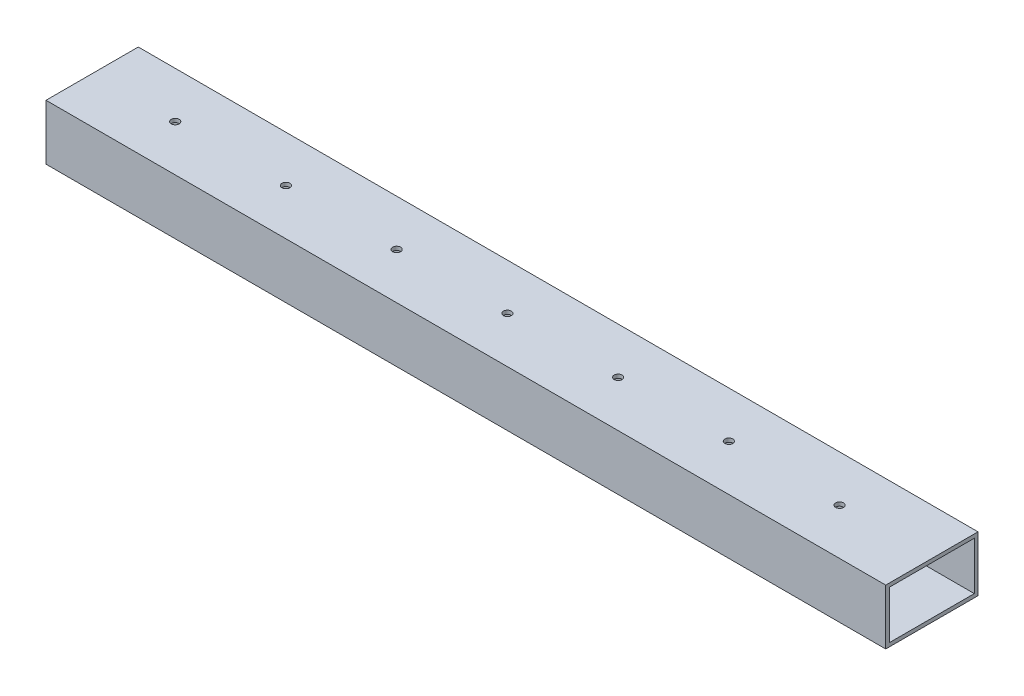
ISO-10303-21;
HEADER;
FILE_DESCRIPTION(('STEP AP214'),'2;1');
FILE_NAME('part.step','',(''),(''),'','','');
FILE_SCHEMA(('AUTOMOTIVE_DESIGN { 1 0 10303 214 1 1 1 1 }'));
ENDSEC;
DATA;
#1=APPLICATION_CONTEXT('core data for automotive mechanical design processes');
#2=APPLICATION_PROTOCOL_DEFINITION('international standard','automotive_design',2000,#1);
#3=PRODUCT_CONTEXT('',#1,'mechanical');
#4=PRODUCT('Part','Part','',(#3));
#5=PRODUCT_RELATED_PRODUCT_CATEGORY('part','',(#4));
#6=PRODUCT_DEFINITION_FORMATION('','',#4);
#7=PRODUCT_DEFINITION_CONTEXT('part definition',#1,'design');
#8=PRODUCT_DEFINITION('design','',#6,#7);
#9=PRODUCT_DEFINITION_SHAPE('','',#8);
#10=(LENGTH_UNIT() NAMED_UNIT(*) SI_UNIT(.MILLI.,.METRE.));
#11=(NAMED_UNIT(*) PLANE_ANGLE_UNIT() SI_UNIT($,.RADIAN.));
#12=(NAMED_UNIT(*) SI_UNIT($,.STERADIAN.) SOLID_ANGLE_UNIT());
#13=UNCERTAINTY_MEASURE_WITH_UNIT(LENGTH_MEASURE(1.E-05),#10,'distance_accuracy_value','');
#14=(GEOMETRIC_REPRESENTATION_CONTEXT(3) GLOBAL_UNCERTAINTY_ASSIGNED_CONTEXT((#13)) GLOBAL_UNIT_ASSIGNED_CONTEXT((#10,
#11,#12)) REPRESENTATION_CONTEXT('',''));
#15=CARTESIAN_POINT('',(0.,0.,0.));
#16=DIRECTION('',(0.,0.,1.));
#17=DIRECTION('',(1.,0.,0.));
#18=AXIS2_PLACEMENT_3D('',#15,#16,#17);
#19=CARTESIAN_POINT('',(181.507280679868,-229.299072168843,-866.486147986318));
#20=DIRECTION('',(0.,1.,0.));
#21=DIRECTION('',(0.,0.,1.));
#22=AXIS2_PLACEMENT_3D('',#19,#20,#21);
#23=CYLINDRICAL_SURFACE('',#22,4.3);
#24=CARTESIAN_POINT('',(181.507280679868,-169.299072168843,-866.486147986318));
#25=DIRECTION('',(0.,1.,0.));
#26=DIRECTION('',(0.,0.,1.));
#27=AXIS2_PLACEMENT_3D('',#24,#25,#26);
#28=CIRCLE('',#27,4.3);
#29=CARTESIAN_POINT('',(181.507280679868,-169.299072168843,-862.186147986318));
#30=VERTEX_POINT('',#29);
#31=EDGE_CURVE('E20',#30,#30,#28,.T.);
#32=ORIENTED_EDGE('',*,*,#31,.T.);
#33=EDGE_LOOP('',(#32));
#34=FACE_BOUND('',#33,.T.);
#35=CARTESIAN_POINT('',(181.507280679868,-173.299072168843,-866.486147986318));
#36=DIRECTION('',(0.,1.,0.));
#37=DIRECTION('',(0.,0.,1.));
#38=AXIS2_PLACEMENT_3D('',#35,#36,#37);
#39=CIRCLE('',#38,4.3);
#40=CARTESIAN_POINT('',(181.507280679868,-173.299072168843,-862.186147986318));
#41=VERTEX_POINT('',#40);
#42=EDGE_CURVE('E102',#41,#41,#39,.T.);
#43=ORIENTED_EDGE('',*,*,#42,.F.);
#44=EDGE_LOOP('',(#43));
#45=FACE_BOUND('',#44,.T.);
#46=ADVANCED_FACE('F17',(#34,#45),#23,.F.);
#47=CARTESIAN_POINT('',(61.5072806798675,-229.299072168843,-866.486147986318));
#48=DIRECTION('',(0.,1.,0.));
#49=DIRECTION('',(0.,0.,1.));
#50=AXIS2_PLACEMENT_3D('',#47,#48,#49);
#51=CYLINDRICAL_SURFACE('',#50,4.3);
#52=CARTESIAN_POINT('',(61.5072806798675,-173.299072168843,-866.486147986318));
#53=DIRECTION('',(0.,1.,0.));
#54=DIRECTION('',(0.,0.,1.));
#55=AXIS2_PLACEMENT_3D('',#52,#53,#54);
#56=CIRCLE('',#55,4.3);
#57=CARTESIAN_POINT('',(61.5072806798675,-173.299072168843,-862.186147986318));
#58=VERTEX_POINT('',#57);
#59=EDGE_CURVE('E209',#58,#58,#56,.T.);
#60=ORIENTED_EDGE('',*,*,#59,.F.);
#61=EDGE_LOOP('',(#60));
#62=FACE_BOUND('',#61,.T.);
#63=CARTESIAN_POINT('',(61.5072806798675,-169.299072168843,-866.486147986318));
#64=DIRECTION('',(0.,1.,0.));
#65=DIRECTION('',(0.,0.,1.));
#66=AXIS2_PLACEMENT_3D('',#63,#64,#65);
#67=CIRCLE('',#66,4.3);
#68=CARTESIAN_POINT('',(61.5072806798675,-169.299072168843,-862.186147986318));
#69=VERTEX_POINT('',#68);
#70=EDGE_CURVE('E234',#69,#69,#67,.T.);
#71=ORIENTED_EDGE('',*,*,#70,.T.);
#72=EDGE_LOOP('',(#71));
#73=FACE_BOUND('',#72,.T.);
#74=ADVANCED_FACE('F383',(#62,#73),#51,.F.);
#75=CARTESIAN_POINT('',(-58.4927193201326,-229.299072168843,-866.486147986318));
#76=DIRECTION('',(0.,1.,0.));
#77=DIRECTION('',(0.,0.,1.));
#78=AXIS2_PLACEMENT_3D('',#75,#76,#77);
#79=CYLINDRICAL_SURFACE('',#78,4.3);
#80=CARTESIAN_POINT('',(-58.4927193201326,-169.299072168843,-866.486147986318));
#81=DIRECTION('',(0.,1.,0.));
#82=DIRECTION('',(0.,0.,1.));
#83=AXIS2_PLACEMENT_3D('',#80,#81,#82);
#84=CIRCLE('',#83,4.3);
#85=CARTESIAN_POINT('',(-58.4927193201326,-169.299072168843,-862.186147986318));
#86=VERTEX_POINT('',#85);
#87=EDGE_CURVE('E231',#86,#86,#84,.T.);
#88=ORIENTED_EDGE('',*,*,#87,.T.);
#89=EDGE_LOOP('',(#88));
#90=FACE_BOUND('',#89,.T.);
#91=CARTESIAN_POINT('',(-58.4927193201326,-173.299072168843,-866.486147986318));
#92=DIRECTION('',(0.,1.,0.));
#93=DIRECTION('',(0.,0.,1.));
#94=AXIS2_PLACEMENT_3D('',#91,#92,#93);
#95=CIRCLE('',#94,4.3);
#96=CARTESIAN_POINT('',(-58.4927193201326,-173.299072168843,-862.186147986318));
#97=VERTEX_POINT('',#96);
#98=EDGE_CURVE('E205',#97,#97,#95,.T.);
#99=ORIENTED_EDGE('',*,*,#98,.F.);
#100=EDGE_LOOP('',(#99));
#101=FACE_BOUND('',#100,.T.);
#102=ADVANCED_FACE('F380',(#90,#101),#79,.F.);
#103=CARTESIAN_POINT('',(-178.492719320133,-229.299072168843,-866.486147986318));
#104=DIRECTION('',(0.,1.,0.));
#105=DIRECTION('',(0.,0.,1.));
#106=AXIS2_PLACEMENT_3D('',#103,#104,#105);
#107=CYLINDRICAL_SURFACE('',#106,4.3);
#108=CARTESIAN_POINT('',(-178.492719320133,-169.299072168843,-866.486147986318));
#109=DIRECTION('',(0.,1.,0.));
#110=DIRECTION('',(0.,0.,1.));
#111=AXIS2_PLACEMENT_3D('',#108,#109,#110);
#112=CIRCLE('',#111,4.3);
#113=CARTESIAN_POINT('',(-178.492719320133,-169.299072168843,-862.186147986318));
#114=VERTEX_POINT('',#113);
#115=EDGE_CURVE('E227',#114,#114,#112,.T.);
#116=ORIENTED_EDGE('',*,*,#115,.T.);
#117=EDGE_LOOP('',(#116));
#118=FACE_BOUND('',#117,.T.);
#119=CARTESIAN_POINT('',(-178.492719320133,-173.299072168843,-866.486147986318));
#120=DIRECTION('',(0.,1.,0.));
#121=DIRECTION('',(0.,0.,1.));
#122=AXIS2_PLACEMENT_3D('',#119,#120,#121);
#123=CIRCLE('',#122,4.3);
#124=CARTESIAN_POINT('',(-178.492719320133,-173.299072168843,-862.186147986318));
#125=VERTEX_POINT('',#124);
#126=EDGE_CURVE('E201',#125,#125,#123,.T.);
#127=ORIENTED_EDGE('',*,*,#126,.F.);
#128=EDGE_LOOP('',(#127));
#129=FACE_BOUND('',#128,.T.);
#130=ADVANCED_FACE('F376',(#118,#129),#107,.F.);
#131=CARTESIAN_POINT('',(-298.492719320131,-229.299072168843,-866.486147986318));
#132=DIRECTION('',(0.,1.,0.));
#133=DIRECTION('',(0.,0.,1.));
#134=AXIS2_PLACEMENT_3D('',#131,#132,#133);
#135=CYLINDRICAL_SURFACE('',#134,4.3);
#136=CARTESIAN_POINT('',(-298.492719320131,-169.299072168843,-866.486147986318));
#137=DIRECTION('',(0.,1.,0.));
#138=DIRECTION('',(0.,0.,1.));
#139=AXIS2_PLACEMENT_3D('',#136,#137,#138);
#140=CIRCLE('',#139,4.3);
#141=CARTESIAN_POINT('',(-298.492719320131,-169.299072168843,-862.186147986318));
#142=VERTEX_POINT('',#141);
#143=EDGE_CURVE('E223',#142,#142,#140,.T.);
#144=ORIENTED_EDGE('',*,*,#143,.T.);
#145=EDGE_LOOP('',(#144));
#146=FACE_BOUND('',#145,.T.);
#147=CARTESIAN_POINT('',(-298.492719320131,-173.299072168843,-866.486147986318));
#148=DIRECTION('',(0.,1.,0.));
#149=DIRECTION('',(0.,0.,1.));
#150=AXIS2_PLACEMENT_3D('',#147,#148,#149);
#151=CIRCLE('',#150,4.3);
#152=CARTESIAN_POINT('',(-298.492719320131,-173.299072168843,-862.186147986318));
#153=VERTEX_POINT('',#152);
#154=EDGE_CURVE('E197',#153,#153,#151,.T.);
#155=ORIENTED_EDGE('',*,*,#154,.F.);
#156=EDGE_LOOP('',(#155));
#157=FACE_BOUND('',#156,.T.);
#158=ADVANCED_FACE('F372',(#146,#157),#135,.F.);
#159=CARTESIAN_POINT('',(-418.492719320131,-229.299072168843,-866.486147986318));
#160=DIRECTION('',(0.,1.,0.));
#161=DIRECTION('',(0.,0.,1.));
#162=AXIS2_PLACEMENT_3D('',#159,#160,#161);
#163=CYLINDRICAL_SURFACE('',#162,4.3);
#164=CARTESIAN_POINT('',(-418.492719320131,-173.299072168843,-866.486147986318));
#165=DIRECTION('',(0.,1.,0.));
#166=DIRECTION('',(0.,0.,1.));
#167=AXIS2_PLACEMENT_3D('',#164,#165,#166);
#168=CIRCLE('',#167,4.3);
#169=CARTESIAN_POINT('',(-418.492719320131,-173.299072168843,-862.186147986318));
#170=VERTEX_POINT('',#169);
#171=EDGE_CURVE('E193',#170,#170,#168,.T.);
#172=ORIENTED_EDGE('',*,*,#171,.F.);
#173=EDGE_LOOP('',(#172));
#174=FACE_BOUND('',#173,.T.);
#175=CARTESIAN_POINT('',(-418.492719320131,-169.299072168843,-866.486147986318));
#176=DIRECTION('',(0.,1.,0.));
#177=DIRECTION('',(0.,0.,1.));
#178=AXIS2_PLACEMENT_3D('',#175,#176,#177);
#179=CIRCLE('',#178,4.3);
#180=CARTESIAN_POINT('',(-418.492719320131,-169.299072168843,-862.186147986318));
#181=VERTEX_POINT('',#180);
#182=EDGE_CURVE('E219',#181,#181,#179,.T.);
#183=ORIENTED_EDGE('',*,*,#182,.T.);
#184=EDGE_LOOP('',(#183));
#185=FACE_BOUND('',#184,.T.);
#186=ADVANCED_FACE('F368',(#174,#185),#163,.F.);
#187=CARTESIAN_POINT('',(-538.492719320132,-229.299072168843,-866.486147986318));
#188=DIRECTION('',(0.,1.,0.));
#189=DIRECTION('',(0.,0.,1.));
#190=AXIS2_PLACEMENT_3D('',#187,#188,#189);
#191=CYLINDRICAL_SURFACE('',#190,4.3);
#192=CARTESIAN_POINT('',(-538.492719320132,-169.299072168843,-866.486147986318));
#193=DIRECTION('',(0.,1.,0.));
#194=DIRECTION('',(0.,0.,1.));
#195=AXIS2_PLACEMENT_3D('',#192,#193,#194);
#196=CIRCLE('',#195,4.3);
#197=CARTESIAN_POINT('',(-538.492719320132,-169.299072168843,-862.186147986318));
#198=VERTEX_POINT('',#197);
#199=EDGE_CURVE('E103',#198,#198,#196,.T.);
#200=ORIENTED_EDGE('',*,*,#199,.T.);
#201=EDGE_LOOP('',(#200));
#202=FACE_BOUND('',#201,.T.);
#203=CARTESIAN_POINT('',(-538.492719320132,-173.299072168843,-866.486147986318));
#204=DIRECTION('',(0.,1.,0.));
#205=DIRECTION('',(0.,0.,1.));
#206=AXIS2_PLACEMENT_3D('',#203,#204,#205);
#207=CIRCLE('',#206,4.3);
#208=CARTESIAN_POINT('',(-538.492719320132,-173.299072168843,-862.186147986318));
#209=VERTEX_POINT('',#208);
#210=EDGE_CURVE('E134',#209,#209,#207,.T.);
#211=ORIENTED_EDGE('',*,*,#210,.F.);
#212=EDGE_LOOP('',(#211));
#213=FACE_BOUND('',#212,.T.);
#214=ADVANCED_FACE('F247',(#202,#213),#191,.F.);
#215=CARTESIAN_POINT('',(-129.876091028777,-169.299072168843,-866.486147986318));
#216=DIRECTION('',(0.,-1.,0.));
#217=DIRECTION('',(0.,0.,-1.));
#218=AXIS2_PLACEMENT_3D('',#215,#216,#217);
#219=PLANE('',#218);
#220=ORIENTED_EDGE('',*,*,#199,.F.);
#221=EDGE_LOOP('',(#220));
#222=FACE_BOUND('',#221,.T.);
#223=ORIENTED_EDGE('',*,*,#182,.F.);
#224=EDGE_LOOP('',(#223));
#225=FACE_BOUND('',#224,.T.);
#226=ORIENTED_EDGE('',*,*,#143,.F.);
#227=EDGE_LOOP('',(#226));
#228=FACE_BOUND('',#227,.T.);
#229=ORIENTED_EDGE('',*,*,#115,.F.);
#230=EDGE_LOOP('',(#229));
#231=FACE_BOUND('',#230,.T.);
#232=ORIENTED_EDGE('',*,*,#87,.F.);
#233=EDGE_LOOP('',(#232));
#234=FACE_BOUND('',#233,.T.);
#235=ORIENTED_EDGE('',*,*,#70,.F.);
#236=EDGE_LOOP('',(#235));
#237=FACE_BOUND('',#236,.T.);
#238=ORIENTED_EDGE('',*,*,#31,.F.);
#239=EDGE_LOOP('',(#238));
#240=FACE_BOUND('',#239,.T.);
#241=DIRECTION('',(-1.,0.,0.));
#242=VECTOR('',#241,1.);
#243=CARTESIAN_POINT('',(-129.876091028777,-169.299072168843,-816.486147986318));
#244=LINE('',#243,#242);
#245=CARTESIAN_POINT('',(-628.489347611488,-169.299072168843,-816.486147986318));
#246=VERTEX_POINT('',#245);
#247=CARTESIAN_POINT('',(281.510652388512,-169.299072168843,-816.486147986318));
#248=VERTEX_POINT('',#247);
#249=EDGE_CURVE('E123',#246,#248,#244,.F.);
#250=ORIENTED_EDGE('',*,*,#249,.T.);
#251=DIRECTION('',(0.,0.,-1.));
#252=VECTOR('',#251,1.);
#253=CARTESIAN_POINT('',(281.510652388512,-169.299072168843,-861.467295972638));
#254=LINE('',#253,#252);
#255=CARTESIAN_POINT('',(281.510652388512,-169.299072168843,-916.486147986319));
#256=VERTEX_POINT('',#255);
#257=EDGE_CURVE('E91',#256,#248,#254,.F.);
#258=ORIENTED_EDGE('',*,*,#257,.F.);
#259=DIRECTION('',(-1.,0.,0.));
#260=VECTOR('',#259,1.);
#261=CARTESIAN_POINT('',(-129.876091028777,-169.299072168843,-916.486147986319));
#262=LINE('',#261,#260);
#263=CARTESIAN_POINT('',(-628.489347611488,-169.299072168843,-916.486147986319));
#264=VERTEX_POINT('',#263);
#265=EDGE_CURVE('E294',#264,#256,#262,.F.);
#266=ORIENTED_EDGE('',*,*,#265,.F.);
#267=DIRECTION('',(0.,0.,-1.));
#268=VECTOR('',#267,1.);
#269=CARTESIAN_POINT('',(-628.489347611488,-169.299072168843,-861.467295972638));
#270=LINE('',#269,#268);
#271=EDGE_CURVE('E254',#264,#246,#270,.F.);
#272=ORIENTED_EDGE('',*,*,#271,.T.);
#273=EDGE_LOOP('',(#250,#258,#266,#272));
#274=FACE_BOUND('',#273,.T.);
#275=ADVANCED_FACE('F244',(#222,#225,#228,#231,#234,#237,#240,#274),#219,.F.);
#276=CARTESIAN_POINT('',(-129.876091028777,-199.299072168843,-820.486147986319));
#277=DIRECTION('',(0.,0.,-1.));
#278=DIRECTION('',(-1.,0.,0.));
#279=AXIS2_PLACEMENT_3D('',#276,#277,#278);
#280=PLANE('',#279);
#281=DIRECTION('',(0.,1.,0.));
#282=VECTOR('',#281,1.);
#283=CARTESIAN_POINT('',(281.510652388512,-246.310397048843,-820.486147986319));
#284=LINE('',#283,#282);
#285=CARTESIAN_POINT('',(281.510652388512,-225.299072168843,-820.486147986319));
#286=VERTEX_POINT('',#285);
#287=CARTESIAN_POINT('',(281.510652388512,-173.299072168843,-820.486147986319));
#288=VERTEX_POINT('',#287);
#289=EDGE_CURVE('E80',#286,#288,#284,.T.);
#290=ORIENTED_EDGE('',*,*,#289,.F.);
#291=DIRECTION('',(1.,0.,0.));
#292=VECTOR('',#291,1.);
#293=CARTESIAN_POINT('',(-129.876091028777,-225.299072168843,-820.486147986319));
#294=LINE('',#293,#292);
#295=CARTESIAN_POINT('',(-628.489347611488,-225.299072168843,-820.486147986319));
#296=VERTEX_POINT('',#295);
#297=EDGE_CURVE('E130',#296,#286,#294,.T.);
#298=ORIENTED_EDGE('',*,*,#297,.F.);
#299=DIRECTION('',(0.,1.,0.));
#300=VECTOR('',#299,1.);
#301=CARTESIAN_POINT('',(-628.489347611488,-246.310397048843,-820.486147986319));
#302=LINE('',#301,#300);
#303=CARTESIAN_POINT('',(-628.489347611488,-173.299072168843,-820.486147986319));
#304=VERTEX_POINT('',#303);
#305=EDGE_CURVE('E97',#296,#304,#302,.T.);
#306=ORIENTED_EDGE('',*,*,#305,.T.);
#307=DIRECTION('',(1.,0.,0.));
#308=VECTOR('',#307,1.);
#309=CARTESIAN_POINT('',(-129.876091028777,-173.299072168843,-820.486147986319));
#310=LINE('',#309,#308);
#311=EDGE_CURVE('E94',#288,#304,#310,.F.);
#312=ORIENTED_EDGE('',*,*,#311,.F.);
#313=EDGE_LOOP('',(#290,#298,#306,#312));
#314=FACE_BOUND('',#313,.T.);
#315=ADVANCED_FACE('F95',(#314),#280,.T.);
#316=CARTESIAN_POINT('',(-129.876091028777,-173.299072168843,-866.486147986318));
#317=DIRECTION('',(0.,-1.,0.));
#318=DIRECTION('',(0.,0.,-1.));
#319=AXIS2_PLACEMENT_3D('',#316,#317,#318);
#320=PLANE('',#319);
#321=ORIENTED_EDGE('',*,*,#210,.T.);
#322=EDGE_LOOP('',(#321));
#323=FACE_BOUND('',#322,.T.);
#324=ORIENTED_EDGE('',*,*,#171,.T.);
#325=EDGE_LOOP('',(#324));
#326=FACE_BOUND('',#325,.T.);
#327=ORIENTED_EDGE('',*,*,#154,.T.);
#328=EDGE_LOOP('',(#327));
#329=FACE_BOUND('',#328,.T.);
#330=ORIENTED_EDGE('',*,*,#126,.T.);
#331=EDGE_LOOP('',(#330));
#332=FACE_BOUND('',#331,.T.);
#333=ORIENTED_EDGE('',*,*,#98,.T.);
#334=EDGE_LOOP('',(#333));
#335=FACE_BOUND('',#334,.T.);
#336=ORIENTED_EDGE('',*,*,#59,.T.);
#337=EDGE_LOOP('',(#336));
#338=FACE_BOUND('',#337,.T.);
#339=ORIENTED_EDGE('',*,*,#42,.T.);
#340=EDGE_LOOP('',(#339));
#341=FACE_BOUND('',#340,.T.);
#342=DIRECTION('',(0.,0.,-1.));
#343=VECTOR('',#342,1.);
#344=CARTESIAN_POINT('',(281.510652388512,-173.299072168843,-861.467295972638));
#345=LINE('',#344,#343);
#346=CARTESIAN_POINT('',(281.510652388512,-173.299072168843,-912.48614798632));
#347=VERTEX_POINT('',#346);
#348=EDGE_CURVE('E85',#288,#347,#345,.T.);
#349=ORIENTED_EDGE('',*,*,#348,.F.);
#350=ORIENTED_EDGE('',*,*,#311,.T.);
#351=DIRECTION('',(0.,0.,-1.));
#352=VECTOR('',#351,1.);
#353=CARTESIAN_POINT('',(-628.489347611488,-173.299072168843,-861.467295972638));
#354=LINE('',#353,#352);
#355=CARTESIAN_POINT('',(-628.489347611488,-173.299072168843,-912.48614798632));
#356=VERTEX_POINT('',#355);
#357=EDGE_CURVE('E277',#304,#356,#354,.T.);
#358=ORIENTED_EDGE('',*,*,#357,.T.);
#359=DIRECTION('',(-1.,0.,0.));
#360=VECTOR('',#359,1.);
#361=CARTESIAN_POINT('',(-129.876091028777,-173.299072168843,-912.48614798632));
#362=LINE('',#361,#360);
#363=EDGE_CURVE('E106',#356,#347,#362,.F.);
#364=ORIENTED_EDGE('',*,*,#363,.T.);
#365=EDGE_LOOP('',(#349,#350,#358,#364));
#366=FACE_BOUND('',#365,.T.);
#367=ADVANCED_FACE('F105',(#323,#326,#329,#332,#335,#338,#341,#366),#320,.T.);
#368=CARTESIAN_POINT('',(-129.876091028777,-199.299072168843,-912.48614798632));
#369=DIRECTION('',(0.,0.,-1.));
#370=DIRECTION('',(-1.,0.,0.));
#371=AXIS2_PLACEMENT_3D('',#368,#369,#370);
#372=PLANE('',#371);
#373=DIRECTION('',(1.,0.,0.));
#374=VECTOR('',#373,1.);
#375=CARTESIAN_POINT('',(-129.876091028777,-225.299072168843,-912.48614798632));
#376=LINE('',#375,#374);
#377=CARTESIAN_POINT('',(281.510652388512,-225.299072168843,-912.48614798632));
#378=VERTEX_POINT('',#377);
#379=CARTESIAN_POINT('',(-628.489347611488,-225.299072168843,-912.48614798632));
#380=VERTEX_POINT('',#379);
#381=EDGE_CURVE('E127',#378,#380,#376,.F.);
#382=ORIENTED_EDGE('',*,*,#381,.F.);
#383=DIRECTION('',(0.,1.,0.));
#384=VECTOR('',#383,1.);
#385=CARTESIAN_POINT('',(281.510652388512,-246.310397048843,-912.48614798632));
#386=LINE('',#385,#384);
#387=EDGE_CURVE('E109',#347,#378,#386,.F.);
#388=ORIENTED_EDGE('',*,*,#387,.F.);
#389=ORIENTED_EDGE('',*,*,#363,.F.);
#390=DIRECTION('',(0.,1.,0.));
#391=VECTOR('',#390,1.);
#392=CARTESIAN_POINT('',(-628.489347611488,-246.310397048843,-912.48614798632));
#393=LINE('',#392,#391);
#394=EDGE_CURVE('E189',#356,#380,#393,.F.);
#395=ORIENTED_EDGE('',*,*,#394,.T.);
#396=EDGE_LOOP('',(#382,#388,#389,#395));
#397=FACE_BOUND('',#396,.T.);
#398=ADVANCED_FACE('F356',(#397),#372,.F.);
#399=CARTESIAN_POINT('',(-129.876091028777,-225.299072168843,-866.486147986318));
#400=DIRECTION('',(0.,1.,0.));
#401=DIRECTION('',(0.,0.,1.));
#402=AXIS2_PLACEMENT_3D('',#399,#400,#401);
#403=PLANE('',#402);
#404=CARTESIAN_POINT('',(-538.492719320132,-225.299072168843,-866.486147986318));
#405=DIRECTION('',(0.,1.,0.));
#406=DIRECTION('',(0.,0.,1.));
#407=AXIS2_PLACEMENT_3D('',#404,#405,#406);
#408=CIRCLE('',#407,4.3);
#409=CARTESIAN_POINT('',(-538.492719320132,-225.299072168843,-862.186147986318));
#410=VERTEX_POINT('',#409);
#411=EDGE_CURVE('E160',#410,#410,#408,.F.);
#412=ORIENTED_EDGE('',*,*,#411,.T.);
#413=EDGE_LOOP('',(#412));
#414=FACE_BOUND('',#413,.T.);
#415=CARTESIAN_POINT('',(-418.492719320131,-225.299072168843,-866.486147986318));
#416=DIRECTION('',(0.,1.,0.));
#417=DIRECTION('',(0.,0.,1.));
#418=AXIS2_PLACEMENT_3D('',#415,#416,#417);
#419=CIRCLE('',#418,4.3);
#420=CARTESIAN_POINT('',(-418.492719320131,-225.299072168843,-862.186147986318));
#421=VERTEX_POINT('',#420);
#422=EDGE_CURVE('E165',#421,#421,#419,.F.);
#423=ORIENTED_EDGE('',*,*,#422,.T.);
#424=EDGE_LOOP('',(#423));
#425=FACE_BOUND('',#424,.T.);
#426=CARTESIAN_POINT('',(-298.492719320131,-225.299072168843,-866.486147986318));
#427=DIRECTION('',(0.,1.,0.));
#428=DIRECTION('',(0.,0.,1.));
#429=AXIS2_PLACEMENT_3D('',#426,#427,#428);
#430=CIRCLE('',#429,4.3);
#431=CARTESIAN_POINT('',(-298.492719320131,-225.299072168843,-862.186147986318));
#432=VERTEX_POINT('',#431);
#433=EDGE_CURVE('E169',#432,#432,#430,.F.);
#434=ORIENTED_EDGE('',*,*,#433,.T.);
#435=EDGE_LOOP('',(#434));
#436=FACE_BOUND('',#435,.T.);
#437=CARTESIAN_POINT('',(-178.492719320133,-225.299072168843,-866.486147986318));
#438=DIRECTION('',(0.,1.,0.));
#439=DIRECTION('',(0.,0.,1.));
#440=AXIS2_PLACEMENT_3D('',#437,#438,#439);
#441=CIRCLE('',#440,4.3);
#442=CARTESIAN_POINT('',(-178.492719320133,-225.299072168843,-862.186147986318));
#443=VERTEX_POINT('',#442);
#444=EDGE_CURVE('E173',#443,#443,#441,.F.);
#445=ORIENTED_EDGE('',*,*,#444,.T.);
#446=EDGE_LOOP('',(#445));
#447=FACE_BOUND('',#446,.T.);
#448=CARTESIAN_POINT('',(-58.4927193201326,-225.299072168843,-866.486147986318));
#449=DIRECTION('',(0.,1.,0.));
#450=DIRECTION('',(0.,0.,1.));
#451=AXIS2_PLACEMENT_3D('',#448,#449,#450);
#452=CIRCLE('',#451,4.3);
#453=CARTESIAN_POINT('',(-58.4927193201326,-225.299072168843,-862.186147986318));
#454=VERTEX_POINT('',#453);
#455=EDGE_CURVE('E177',#454,#454,#452,.F.);
#456=ORIENTED_EDGE('',*,*,#455,.T.);
#457=EDGE_LOOP('',(#456));
#458=FACE_BOUND('',#457,.T.);
#459=CARTESIAN_POINT('',(61.5072806798675,-225.299072168843,-866.486147986318));
#460=DIRECTION('',(0.,1.,0.));
#461=DIRECTION('',(0.,0.,1.));
#462=AXIS2_PLACEMENT_3D('',#459,#460,#461);
#463=CIRCLE('',#462,4.3);
#464=CARTESIAN_POINT('',(61.5072806798675,-225.299072168843,-862.186147986318));
#465=VERTEX_POINT('',#464);
#466=EDGE_CURVE('E181',#465,#465,#463,.F.);
#467=ORIENTED_EDGE('',*,*,#466,.T.);
#468=EDGE_LOOP('',(#467));
#469=FACE_BOUND('',#468,.T.);
#470=CARTESIAN_POINT('',(181.507280679868,-225.299072168843,-866.486147986318));
#471=DIRECTION('',(0.,1.,0.));
#472=DIRECTION('',(0.,0.,1.));
#473=AXIS2_PLACEMENT_3D('',#470,#471,#472);
#474=CIRCLE('',#473,4.3);
#475=CARTESIAN_POINT('',(181.507280679868,-225.299072168843,-862.186147986318));
#476=VERTEX_POINT('',#475);
#477=EDGE_CURVE('E185',#476,#476,#474,.F.);
#478=ORIENTED_EDGE('',*,*,#477,.T.);
#479=EDGE_LOOP('',(#478));
#480=FACE_BOUND('',#479,.T.);
#481=DIRECTION('',(0.,0.,-1.));
#482=VECTOR('',#481,1.);
#483=CARTESIAN_POINT('',(281.510652388512,-225.299072168843,-861.467295972638));
#484=LINE('',#483,#482);
#485=EDGE_CURVE('E88',#378,#286,#484,.F.);
#486=ORIENTED_EDGE('',*,*,#485,.F.);
#487=ORIENTED_EDGE('',*,*,#381,.T.);
#488=DIRECTION('',(0.,0.,-1.));
#489=VECTOR('',#488,1.);
#490=CARTESIAN_POINT('',(-628.489347611488,-225.299072168843,-861.467295972638));
#491=LINE('',#490,#489);
#492=EDGE_CURVE('E282',#380,#296,#491,.F.);
#493=ORIENTED_EDGE('',*,*,#492,.T.);
#494=ORIENTED_EDGE('',*,*,#297,.T.);
#495=EDGE_LOOP('',(#486,#487,#493,#494));
#496=FACE_BOUND('',#495,.T.);
#497=ADVANCED_FACE('F353',(#414,#425,#436,#447,#458,#469,#480,#496),#403,.T.);
#498=CARTESIAN_POINT('',(-129.876091028777,-199.299072168843,-816.486147986318));
#499=DIRECTION('',(0.,0.,-1.));
#500=DIRECTION('',(-1.,0.,0.));
#501=AXIS2_PLACEMENT_3D('',#498,#499,#500);
#502=PLANE('',#501);
#503=DIRECTION('',(1.,0.,0.));
#504=VECTOR('',#503,1.);
#505=CARTESIAN_POINT('',(-129.876091028777,-229.299072168843,-816.486147986318));
#506=LINE('',#505,#504);
#507=CARTESIAN_POINT('',(-628.489347611488,-229.299072168843,-816.486147986318));
#508=VERTEX_POINT('',#507);
#509=CARTESIAN_POINT('',(281.510652388512,-229.299072168843,-816.486147986318));
#510=VERTEX_POINT('',#509);
#511=EDGE_CURVE('E164',#508,#510,#506,.T.);
#512=ORIENTED_EDGE('',*,*,#511,.T.);
#513=DIRECTION('',(0.,1.,0.));
#514=VECTOR('',#513,1.);
#515=CARTESIAN_POINT('',(281.510652388512,-246.310397048843,-816.486147986318));
#516=LINE('',#515,#514);
#517=EDGE_CURVE('E120',#248,#510,#516,.F.);
#518=ORIENTED_EDGE('',*,*,#517,.F.);
#519=ORIENTED_EDGE('',*,*,#249,.F.);
#520=DIRECTION('',(0.,1.,0.));
#521=VECTOR('',#520,1.);
#522=CARTESIAN_POINT('',(-628.489347611488,-246.310397048843,-816.486147986318));
#523=LINE('',#522,#521);
#524=EDGE_CURVE('E264',#246,#508,#523,.F.);
#525=ORIENTED_EDGE('',*,*,#524,.T.);
#526=EDGE_LOOP('',(#512,#518,#519,#525));
#527=FACE_BOUND('',#526,.T.);
#528=ADVANCED_FACE('F263',(#527),#502,.F.);
#529=CARTESIAN_POINT('',(281.510652388512,-246.310397048843,-861.467295972638));
#530=DIRECTION('',(1.,0.,0.));
#531=DIRECTION('',(0.,0.,-1.));
#532=AXIS2_PLACEMENT_3D('',#529,#530,#531);
#533=PLANE('',#532);
#534=ORIENTED_EDGE('',*,*,#387,.T.);
#535=ORIENTED_EDGE('',*,*,#485,.T.);
#536=ORIENTED_EDGE('',*,*,#289,.T.);
#537=ORIENTED_EDGE('',*,*,#348,.T.);
#538=EDGE_LOOP('',(#534,#535,#536,#537));
#539=FACE_BOUND('',#538,.T.);
#540=DIRECTION('',(0.,1.,0.));
#541=VECTOR('',#540,1.);
#542=CARTESIAN_POINT('',(281.510652388512,-199.299072168843,-916.486147986319));
#543=LINE('',#542,#541);
#544=CARTESIAN_POINT('',(281.510652388512,-229.299072168843,-916.486147986319));
#545=VERTEX_POINT('',#544);
#546=EDGE_CURVE('E261',#256,#545,#543,.F.);
#547=ORIENTED_EDGE('',*,*,#546,.F.);
#548=ORIENTED_EDGE('',*,*,#257,.T.);
#549=ORIENTED_EDGE('',*,*,#517,.T.);
#550=DIRECTION('',(0.,0.,1.));
#551=VECTOR('',#550,1.);
#552=CARTESIAN_POINT('',(281.510652388512,-229.299072168843,-866.486147986318));
#553=LINE('',#552,#551);
#554=EDGE_CURVE('E267',#510,#545,#553,.F.);
#555=ORIENTED_EDGE('',*,*,#554,.T.);
#556=EDGE_LOOP('',(#547,#548,#549,#555));
#557=FACE_BOUND('',#556,.T.);
#558=ADVANCED_FACE('F82',(#539,#557),#533,.T.);
#559=CARTESIAN_POINT('',(-129.876091028777,-199.299072168843,-916.486147986319));
#560=DIRECTION('',(0.,0.,-1.));
#561=DIRECTION('',(-1.,0.,0.));
#562=AXIS2_PLACEMENT_3D('',#559,#560,#561);
#563=PLANE('',#562);
#564=ORIENTED_EDGE('',*,*,#546,.T.);
#565=DIRECTION('',(1.,0.,0.));
#566=VECTOR('',#565,1.);
#567=CARTESIAN_POINT('',(-129.876091028777,-229.299072168843,-916.486147986319));
#568=LINE('',#567,#566);
#569=CARTESIAN_POINT('',(-628.489347611488,-229.299072168843,-916.486147986319));
#570=VERTEX_POINT('',#569);
#571=EDGE_CURVE('E270',#545,#570,#568,.F.);
#572=ORIENTED_EDGE('',*,*,#571,.T.);
#573=DIRECTION('',(0.,1.,0.));
#574=VECTOR('',#573,1.);
#575=CARTESIAN_POINT('',(-628.489347611488,-246.310397048843,-916.486147986319));
#576=LINE('',#575,#574);
#577=EDGE_CURVE('E36',#570,#264,#576,.T.);
#578=ORIENTED_EDGE('',*,*,#577,.T.);
#579=ORIENTED_EDGE('',*,*,#265,.T.);
#580=EDGE_LOOP('',(#564,#572,#578,#579));
#581=FACE_BOUND('',#580,.T.);
#582=ADVANCED_FACE('F345',(#581),#563,.T.);
#583=CARTESIAN_POINT('',(-628.489347611488,-246.310397048843,-861.467295972638));
#584=DIRECTION('',(1.,0.,0.));
#585=DIRECTION('',(0.,0.,-1.));
#586=AXIS2_PLACEMENT_3D('',#583,#584,#585);
#587=PLANE('',#586);
#588=ORIENTED_EDGE('',*,*,#357,.F.);
#589=ORIENTED_EDGE('',*,*,#305,.F.);
#590=ORIENTED_EDGE('',*,*,#492,.F.);
#591=ORIENTED_EDGE('',*,*,#394,.F.);
#592=EDGE_LOOP('',(#588,#589,#590,#591));
#593=FACE_BOUND('',#592,.T.);
#594=DIRECTION('',(0.,0.,1.));
#595=VECTOR('',#594,1.);
#596=CARTESIAN_POINT('',(-628.489347611488,-229.299072168843,-866.486147986318));
#597=LINE('',#596,#595);
#598=EDGE_CURVE('E159',#570,#508,#597,.T.);
#599=ORIENTED_EDGE('',*,*,#598,.T.);
#600=ORIENTED_EDGE('',*,*,#524,.F.);
#601=ORIENTED_EDGE('',*,*,#271,.F.);
#602=ORIENTED_EDGE('',*,*,#577,.F.);
#603=EDGE_LOOP('',(#599,#600,#601,#602));
#604=FACE_BOUND('',#603,.T.);
#605=ADVANCED_FACE('F305',(#593,#604),#587,.F.);
#606=CARTESIAN_POINT('',(181.507280679868,-229.299072168843,-866.486147986318));
#607=DIRECTION('',(0.,1.,0.));
#608=DIRECTION('',(0.,0.,1.));
#609=AXIS2_PLACEMENT_3D('',#606,#607,#608);
#610=CYLINDRICAL_SURFACE('',#609,4.3);
#611=ORIENTED_EDGE('',*,*,#477,.F.);
#612=EDGE_LOOP('',(#611));
#613=FACE_BOUND('',#612,.T.);
#614=CARTESIAN_POINT('',(181.507280679868,-229.299072168843,-866.486147986318));
#615=DIRECTION('',(0.,1.,0.));
#616=DIRECTION('',(0.,0.,1.));
#617=AXIS2_PLACEMENT_3D('',#614,#615,#616);
#618=CIRCLE('',#617,4.3);
#619=CARTESIAN_POINT('',(181.507280679868,-229.299072168843,-862.186147986318));
#620=VERTEX_POINT('',#619);
#621=EDGE_CURVE('E155',#620,#620,#618,.F.);
#622=ORIENTED_EDGE('',*,*,#621,.T.);
#623=EDGE_LOOP('',(#622));
#624=FACE_BOUND('',#623,.T.);
#625=ADVANCED_FACE('F338',(#613,#624),#610,.F.);
#626=CARTESIAN_POINT('',(61.5072806798675,-229.299072168843,-866.486147986318));
#627=DIRECTION('',(0.,1.,0.));
#628=DIRECTION('',(0.,0.,1.));
#629=AXIS2_PLACEMENT_3D('',#626,#627,#628);
#630=CYLINDRICAL_SURFACE('',#629,4.3);
#631=CARTESIAN_POINT('',(61.5072806798675,-229.299072168843,-866.486147986318));
#632=DIRECTION('',(0.,1.,0.));
#633=DIRECTION('',(0.,0.,1.));
#634=AXIS2_PLACEMENT_3D('',#631,#632,#633);
#635=CIRCLE('',#634,4.3);
#636=CARTESIAN_POINT('',(61.5072806798675,-229.299072168843,-862.186147986318));
#637=VERTEX_POINT('',#636);
#638=EDGE_CURVE('E151',#637,#637,#635,.F.);
#639=ORIENTED_EDGE('',*,*,#638,.T.);
#640=EDGE_LOOP('',(#639));
#641=FACE_BOUND('',#640,.T.);
#642=ORIENTED_EDGE('',*,*,#466,.F.);
#643=EDGE_LOOP('',(#642));
#644=FACE_BOUND('',#643,.T.);
#645=ADVANCED_FACE('F334',(#641,#644),#630,.F.);
#646=CARTESIAN_POINT('',(-58.4927193201326,-229.299072168843,-866.486147986318));
#647=DIRECTION('',(0.,1.,0.));
#648=DIRECTION('',(0.,0.,1.));
#649=AXIS2_PLACEMENT_3D('',#646,#647,#648);
#650=CYLINDRICAL_SURFACE('',#649,4.3);
#651=CARTESIAN_POINT('',(-58.4927193201326,-229.299072168843,-866.486147986318));
#652=DIRECTION('',(0.,1.,0.));
#653=DIRECTION('',(0.,0.,1.));
#654=AXIS2_PLACEMENT_3D('',#651,#652,#653);
#655=CIRCLE('',#654,4.3);
#656=CARTESIAN_POINT('',(-58.4927193201326,-229.299072168843,-862.186147986318));
#657=VERTEX_POINT('',#656);
#658=EDGE_CURVE('E147',#657,#657,#655,.F.);
#659=ORIENTED_EDGE('',*,*,#658,.T.);
#660=EDGE_LOOP('',(#659));
#661=FACE_BOUND('',#660,.T.);
#662=ORIENTED_EDGE('',*,*,#455,.F.);
#663=EDGE_LOOP('',(#662));
#664=FACE_BOUND('',#663,.T.);
#665=ADVANCED_FACE('F330',(#661,#664),#650,.F.);
#666=CARTESIAN_POINT('',(-178.492719320133,-229.299072168843,-866.486147986318));
#667=DIRECTION('',(0.,1.,0.));
#668=DIRECTION('',(0.,0.,1.));
#669=AXIS2_PLACEMENT_3D('',#666,#667,#668);
#670=CYLINDRICAL_SURFACE('',#669,4.3);
#671=ORIENTED_EDGE('',*,*,#444,.F.);
#672=EDGE_LOOP('',(#671));
#673=FACE_BOUND('',#672,.T.);
#674=CARTESIAN_POINT('',(-178.492719320133,-229.299072168843,-866.486147986318));
#675=DIRECTION('',(0.,1.,0.));
#676=DIRECTION('',(0.,0.,1.));
#677=AXIS2_PLACEMENT_3D('',#674,#675,#676);
#678=CIRCLE('',#677,4.3);
#679=CARTESIAN_POINT('',(-178.492719320133,-229.299072168843,-862.186147986318));
#680=VERTEX_POINT('',#679);
#681=EDGE_CURVE('E143',#680,#680,#678,.F.);
#682=ORIENTED_EDGE('',*,*,#681,.T.);
#683=EDGE_LOOP('',(#682));
#684=FACE_BOUND('',#683,.T.);
#685=ADVANCED_FACE('F326',(#673,#684),#670,.F.);
#686=CARTESIAN_POINT('',(-298.492719320131,-229.299072168843,-866.486147986318));
#687=DIRECTION('',(0.,1.,0.));
#688=DIRECTION('',(0.,0.,1.));
#689=AXIS2_PLACEMENT_3D('',#686,#687,#688);
#690=CYLINDRICAL_SURFACE('',#689,4.3);
#691=ORIENTED_EDGE('',*,*,#433,.F.);
#692=EDGE_LOOP('',(#691));
#693=FACE_BOUND('',#692,.T.);
#694=CARTESIAN_POINT('',(-298.492719320131,-229.299072168843,-866.486147986318));
#695=DIRECTION('',(0.,1.,0.));
#696=DIRECTION('',(0.,0.,1.));
#697=AXIS2_PLACEMENT_3D('',#694,#695,#696);
#698=CIRCLE('',#697,4.3);
#699=CARTESIAN_POINT('',(-298.492719320131,-229.299072168843,-862.186147986318));
#700=VERTEX_POINT('',#699);
#701=EDGE_CURVE('E139',#700,#700,#698,.F.);
#702=ORIENTED_EDGE('',*,*,#701,.T.);
#703=EDGE_LOOP('',(#702));
#704=FACE_BOUND('',#703,.T.);
#705=ADVANCED_FACE('F322',(#693,#704),#690,.F.);
#706=CARTESIAN_POINT('',(-418.492719320131,-229.299072168843,-866.486147986318));
#707=DIRECTION('',(0.,1.,0.));
#708=DIRECTION('',(0.,0.,1.));
#709=AXIS2_PLACEMENT_3D('',#706,#707,#708);
#710=CYLINDRICAL_SURFACE('',#709,4.3);
#711=ORIENTED_EDGE('',*,*,#422,.F.);
#712=EDGE_LOOP('',(#711));
#713=FACE_BOUND('',#712,.T.);
#714=CARTESIAN_POINT('',(-418.492719320131,-229.299072168843,-866.486147986318));
#715=DIRECTION('',(0.,1.,0.));
#716=DIRECTION('',(0.,0.,1.));
#717=AXIS2_PLACEMENT_3D('',#714,#715,#716);
#718=CIRCLE('',#717,4.3);
#719=CARTESIAN_POINT('',(-418.492719320131,-229.299072168843,-862.186147986318));
#720=VERTEX_POINT('',#719);
#721=EDGE_CURVE('E27',#720,#720,#718,.F.);
#722=ORIENTED_EDGE('',*,*,#721,.T.);
#723=EDGE_LOOP('',(#722));
#724=FACE_BOUND('',#723,.T.);
#725=ADVANCED_FACE('F314',(#713,#724),#710,.F.);
#726=CARTESIAN_POINT('',(-538.492719320132,-229.299072168843,-866.486147986318));
#727=DIRECTION('',(0.,1.,0.));
#728=DIRECTION('',(0.,0.,1.));
#729=AXIS2_PLACEMENT_3D('',#726,#727,#728);
#730=CYLINDRICAL_SURFACE('',#729,4.3);
#731=ORIENTED_EDGE('',*,*,#411,.F.);
#732=EDGE_LOOP('',(#731));
#733=FACE_BOUND('',#732,.T.);
#734=CARTESIAN_POINT('',(-538.492719320132,-229.299072168843,-866.486147986318));
#735=DIRECTION('',(0.,1.,0.));
#736=DIRECTION('',(0.,0.,1.));
#737=AXIS2_PLACEMENT_3D('',#734,#735,#736);
#738=CIRCLE('',#737,4.3);
#739=CARTESIAN_POINT('',(-538.492719320132,-229.299072168843,-862.186147986318));
#740=VERTEX_POINT('',#739);
#741=EDGE_CURVE('E11',#740,#740,#738,.F.);
#742=ORIENTED_EDGE('',*,*,#741,.T.);
#743=EDGE_LOOP('',(#742));
#744=FACE_BOUND('',#743,.T.);
#745=ADVANCED_FACE('F308',(#733,#744),#730,.F.);
#746=CARTESIAN_POINT('',(-129.876091028777,-229.299072168843,-866.486147986318));
#747=DIRECTION('',(0.,1.,0.));
#748=DIRECTION('',(0.,0.,1.));
#749=AXIS2_PLACEMENT_3D('',#746,#747,#748);
#750=PLANE('',#749);
#751=ORIENTED_EDGE('',*,*,#741,.F.);
#752=EDGE_LOOP('',(#751));
#753=FACE_BOUND('',#752,.T.);
#754=ORIENTED_EDGE('',*,*,#721,.F.);
#755=EDGE_LOOP('',(#754));
#756=FACE_BOUND('',#755,.T.);
#757=ORIENTED_EDGE('',*,*,#701,.F.);
#758=EDGE_LOOP('',(#757));
#759=FACE_BOUND('',#758,.T.);
#760=ORIENTED_EDGE('',*,*,#681,.F.);
#761=EDGE_LOOP('',(#760));
#762=FACE_BOUND('',#761,.T.);
#763=ORIENTED_EDGE('',*,*,#658,.F.);
#764=EDGE_LOOP('',(#763));
#765=FACE_BOUND('',#764,.T.);
#766=ORIENTED_EDGE('',*,*,#638,.F.);
#767=EDGE_LOOP('',(#766));
#768=FACE_BOUND('',#767,.T.);
#769=ORIENTED_EDGE('',*,*,#621,.F.);
#770=EDGE_LOOP('',(#769));
#771=FACE_BOUND('',#770,.T.);
#772=ORIENTED_EDGE('',*,*,#571,.F.);
#773=ORIENTED_EDGE('',*,*,#554,.F.);
#774=ORIENTED_EDGE('',*,*,#511,.F.);
#775=ORIENTED_EDGE('',*,*,#598,.F.);
#776=EDGE_LOOP('',(#772,#773,#774,#775));
#777=FACE_BOUND('',#776,.T.);
#778=ADVANCED_FACE('F306',(#753,#756,#759,#762,#765,#768,#771,#777),#750,.F.);
#779=CLOSED_SHELL('',(#46,#74,#102,#130,#158,#186,#214,#275,#315,#367,#398,#497,#528,#558,#582,
#605,#625,#645,#665,#685,#705,#725,#745,#778));
#780=MANIFOLD_SOLID_BREP('B1',#779);
#781=ADVANCED_BREP_SHAPE_REPRESENTATION('',(#18,#780),#14);
#782=SHAPE_DEFINITION_REPRESENTATION(#9,#781);
ENDSEC;
END-ISO-10303-21;
